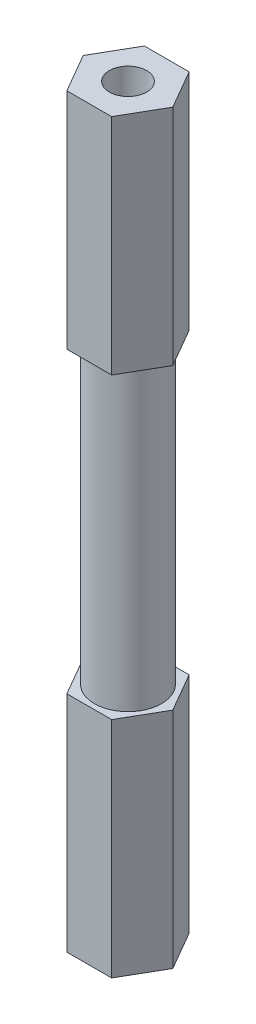
ISO-10303-21;
HEADER;
FILE_DESCRIPTION(('STEP AP214'),'2;1');
FILE_NAME('part.step','',(''),(''),'','','');
FILE_SCHEMA(('AUTOMOTIVE_DESIGN { 1 0 10303 214 1 1 1 1 }'));
ENDSEC;
DATA;
#1=APPLICATION_CONTEXT('core data for automotive mechanical design processes');
#2=APPLICATION_PROTOCOL_DEFINITION('international standard','automotive_design',2000,#1);
#3=PRODUCT_CONTEXT('',#1,'mechanical');
#4=PRODUCT('Part','Part','',(#3));
#5=PRODUCT_RELATED_PRODUCT_CATEGORY('part','',(#4));
#6=PRODUCT_DEFINITION_FORMATION('','',#4);
#7=PRODUCT_DEFINITION_CONTEXT('part definition',#1,'design');
#8=PRODUCT_DEFINITION('design','',#6,#7);
#9=PRODUCT_DEFINITION_SHAPE('','',#8);
#10=(LENGTH_UNIT() NAMED_UNIT(*) SI_UNIT(.MILLI.,.METRE.));
#11=(NAMED_UNIT(*) PLANE_ANGLE_UNIT() SI_UNIT($,.RADIAN.));
#12=(NAMED_UNIT(*) SI_UNIT($,.STERADIAN.) SOLID_ANGLE_UNIT());
#13=UNCERTAINTY_MEASURE_WITH_UNIT(LENGTH_MEASURE(1.E-05),#10,'distance_accuracy_value','');
#14=(GEOMETRIC_REPRESENTATION_CONTEXT(3) GLOBAL_UNCERTAINTY_ASSIGNED_CONTEXT((#13)) GLOBAL_UNIT_ASSIGNED_CONTEXT((#10,
#11,#12)) REPRESENTATION_CONTEXT('',''));
#15=CARTESIAN_POINT('',(0.,0.,0.));
#16=DIRECTION('',(0.,0.,1.));
#17=DIRECTION('',(1.,0.,0.));
#18=AXIS2_PLACEMENT_3D('',#15,#16,#17);
#19=CARTESIAN_POINT('',(0.,10.,0.));
#20=DIRECTION('',(0.,1.,0.));
#21=DIRECTION('',(0.,0.,1.));
#22=AXIS2_PLACEMENT_3D('',#19,#20,#21);
#23=PLANE('',#22);
#24=CARTESIAN_POINT('',(0.,10.,0.));
#25=DIRECTION('',(0.,1.,0.));
#26=DIRECTION('',(0.,0.,1.));
#27=AXIS2_PLACEMENT_3D('',#24,#25,#26);
#28=CIRCLE('',#27,1.24999999999999);
#29=CARTESIAN_POINT('',(0.,10.,1.24999999999999));
#30=VERTEX_POINT('',#29);
#31=EDGE_CURVE('E146',#30,#30,#28,.T.);
#32=ORIENTED_EDGE('',*,*,#31,.T.);
#33=EDGE_LOOP('',(#32));
#34=FACE_BOUND('',#33,.T.);
#35=ADVANCED_FACE('F18',(#34),#23,.T.);
#36=CARTESIAN_POINT('',(0.,-20.,0.));
#37=DIRECTION('',(0.,-1.,0.));
#38=DIRECTION('',(0.,0.,-1.));
#39=AXIS2_PLACEMENT_3D('',#36,#37,#38);
#40=PLANE('',#39);
#41=CARTESIAN_POINT('',(0.,-20.,0.));
#42=DIRECTION('',(0.,1.,0.));
#43=DIRECTION('',(0.,0.,1.));
#44=AXIS2_PLACEMENT_3D('',#41,#42,#43);
#45=CIRCLE('',#44,1.24999999999999);
#46=CARTESIAN_POINT('',(0.,-20.,1.24999999999999));
#47=VERTEX_POINT('',#46);
#48=EDGE_CURVE('E143',#47,#47,#45,.F.);
#49=ORIENTED_EDGE('',*,*,#48,.T.);
#50=EDGE_LOOP('',(#49));
#51=FACE_BOUND('',#50,.T.);
#52=ADVANCED_FACE('F239',(#51),#40,.T.);
#53=CARTESIAN_POINT('',(0.,20.,0.));
#54=DIRECTION('',(0.,1.,0.));
#55=DIRECTION('',(0.,0.,1.));
#56=AXIS2_PLACEMENT_3D('',#53,#54,#55);
#57=CYLINDRICAL_SURFACE('',#56,1.24999999999999);
#58=ORIENTED_EDGE('',*,*,#31,.F.);
#59=EDGE_LOOP('',(#58));
#60=FACE_BOUND('',#59,.T.);
#61=CARTESIAN_POINT('',(0.,20.,0.));
#62=DIRECTION('',(0.,1.,0.));
#63=DIRECTION('',(0.,0.,1.));
#64=AXIS2_PLACEMENT_3D('',#61,#62,#63);
#65=CIRCLE('',#64,1.24999999999999);
#66=CARTESIAN_POINT('',(0.,20.,1.24999999999999));
#67=VERTEX_POINT('',#66);
#68=EDGE_CURVE('E140',#67,#67,#65,.T.);
#69=ORIENTED_EDGE('',*,*,#68,.T.);
#70=EDGE_LOOP('',(#69));
#71=FACE_BOUND('',#70,.T.);
#72=ADVANCED_FACE('F236',(#60,#71),#57,.F.);
#73=CARTESIAN_POINT('',(0.,20.,0.));
#74=DIRECTION('',(0.,1.,0.));
#75=DIRECTION('',(0.,0.,1.));
#76=AXIS2_PLACEMENT_3D('',#73,#74,#75);
#77=CYLINDRICAL_SURFACE('',#76,1.24999999999999);
#78=CARTESIAN_POINT('',(0.,-30.,0.));
#79=DIRECTION('',(0.,1.,0.));
#80=DIRECTION('',(0.,0.,1.));
#81=AXIS2_PLACEMENT_3D('',#78,#79,#80);
#82=CIRCLE('',#81,1.24999999999999);
#83=CARTESIAN_POINT('',(0.,-30.,1.24999999999999));
#84=VERTEX_POINT('',#83);
#85=EDGE_CURVE('E117',#84,#84,#82,.T.);
#86=ORIENTED_EDGE('',*,*,#85,.F.);
#87=EDGE_LOOP('',(#86));
#88=FACE_BOUND('',#87,.T.);
#89=ORIENTED_EDGE('',*,*,#48,.F.);
#90=EDGE_LOOP('',(#89));
#91=FACE_BOUND('',#90,.T.);
#92=ADVANCED_FACE('F233',(#88,#91),#77,.F.);
#93=CARTESIAN_POINT('',(0.,20.,0.));
#94=DIRECTION('',(0.,-1.,0.));
#95=DIRECTION('',(0.,0.,-1.));
#96=AXIS2_PLACEMENT_3D('',#93,#94,#95);
#97=PLANE('',#96);
#98=DIRECTION('',(0.500000000050997,0.,0.866025403754996));
#99=VECTOR('',#98,1.);
#100=CARTESIAN_POINT('',(-3.,20.,0.));
#101=LINE('',#100,#99);
#102=CARTESIAN_POINT('',(-1.499999999898,20.,2.59807621106625));
#103=VERTEX_POINT('',#102);
#104=CARTESIAN_POINT('',(-2.99999999990438,20.,3.31240072663615E-11));
#105=VERTEX_POINT('',#104);
#106=EDGE_CURVE('E440',#103,#105,#101,.F.);
#107=ORIENTED_EDGE('',*,*,#106,.F.);
#108=DIRECTION('',(1.,0.,0.));
#109=VECTOR('',#108,1.);
#110=CARTESIAN_POINT('',(-1.5,20.,2.598076211));
#111=LINE('',#110,#109);
#112=CARTESIAN_POINT('',(1.49999999991076,20.,2.59807621108832));
#113=VERTEX_POINT('',#112);
#114=EDGE_CURVE('E113',#113,#103,#111,.F.);
#115=ORIENTED_EDGE('',*,*,#114,.F.);
#116=DIRECTION('',(0.500000000050997,0.,-0.866025403754996));
#117=VECTOR('',#116,1.);
#118=CARTESIAN_POINT('',(1.5,20.,2.598076211));
#119=LINE('',#118,#117);
#120=CARTESIAN_POINT('',(2.99999999990438,20.,-3.31331723412978E-11));
#121=VERTEX_POINT('',#120);
#122=EDGE_CURVE('E108',#121,#113,#119,.F.);
#123=ORIENTED_EDGE('',*,*,#122,.F.);
#124=DIRECTION('',(-0.500000000050997,0.,-0.866025403754996));
#125=VECTOR('',#124,1.);
#126=CARTESIAN_POINT('',(3.,20.,0.));
#127=LINE('',#126,#125);
#128=CARTESIAN_POINT('',(1.49999999993323,20.,-2.59807621100522));
#129=VERTEX_POINT('',#128);
#130=EDGE_CURVE('E105',#129,#121,#127,.F.);
#131=ORIENTED_EDGE('',*,*,#130,.F.);
#132=DIRECTION('',(-1.,0.,0.));
#133=VECTOR('',#132,1.);
#134=CARTESIAN_POINT('',(1.5,20.,-2.598076211));
#135=LINE('',#134,#133);
#136=CARTESIAN_POINT('',(-1.49999999986614,20.,-2.59807621105519));
#137=VERTEX_POINT('',#136);
#138=EDGE_CURVE('E131',#137,#129,#135,.F.);
#139=ORIENTED_EDGE('',*,*,#138,.F.);
#140=DIRECTION('',(-0.500000000050997,0.,0.866025403754996));
#141=VECTOR('',#140,1.);
#142=CARTESIAN_POINT('',(-1.5,20.,-2.598076211));
#143=LINE('',#142,#141);
#144=EDGE_CURVE('E446',#105,#137,#143,.F.);
#145=ORIENTED_EDGE('',*,*,#144,.F.);
#146=EDGE_LOOP('',(#107,#115,#123,#131,#139,#145));
#147=FACE_BOUND('',#146,.T.);
#148=ORIENTED_EDGE('',*,*,#68,.F.);
#149=EDGE_LOOP('',(#148));
#150=FACE_BOUND('',#149,.T.);
#151=ADVANCED_FACE('F110',(#147,#150),#97,.F.);
#152=CARTESIAN_POINT('',(0.,-30.,0.));
#153=DIRECTION('',(0.,-1.,0.));
#154=DIRECTION('',(0.,0.,-1.));
#155=AXIS2_PLACEMENT_3D('',#152,#153,#154);
#156=PLANE('',#155);
#157=ORIENTED_EDGE('',*,*,#85,.T.);
#158=EDGE_LOOP('',(#157));
#159=FACE_BOUND('',#158,.T.);
#160=DIRECTION('',(-1.,0.,0.));
#161=VECTOR('',#160,1.);
#162=CARTESIAN_POINT('',(1.5,-30.,-2.598076211));
#163=LINE('',#162,#161);
#164=CARTESIAN_POINT('',(1.50000000008808,-30.,-2.59807621101365));
#165=VERTEX_POINT('',#164);
#166=CARTESIAN_POINT('',(-1.49999999990438,-30.,-2.5980762110552));
#167=VERTEX_POINT('',#166);
#168=EDGE_CURVE('E407',#165,#167,#163,.T.);
#169=ORIENTED_EDGE('',*,*,#168,.F.);
#170=DIRECTION('',(-0.500000000050997,0.,-0.866025403754996));
#171=VECTOR('',#170,1.);
#172=CARTESIAN_POINT('',(3.,-30.,0.));
#173=LINE('',#172,#171);
#174=CARTESIAN_POINT('',(3.,-30.,0.));
#175=VERTEX_POINT('',#174);
#176=EDGE_CURVE('E410',#175,#165,#173,.T.);
#177=ORIENTED_EDGE('',*,*,#176,.F.);
#178=DIRECTION('',(0.500000000050997,0.,-0.866025403754996));
#179=VECTOR('',#178,1.);
#180=CARTESIAN_POINT('',(1.5,-30.,2.598076211));
#181=LINE('',#180,#179);
#182=CARTESIAN_POINT('',(1.4999999999745,-30.,2.59807621104416));
#183=VERTEX_POINT('',#182);
#184=EDGE_CURVE('E428',#183,#175,#181,.T.);
#185=ORIENTED_EDGE('',*,*,#184,.F.);
#186=DIRECTION('',(1.,0.,0.));
#187=VECTOR('',#186,1.);
#188=CARTESIAN_POINT('',(-1.5,-30.,2.598076211));
#189=LINE('',#188,#187);
#190=CARTESIAN_POINT('',(-1.49999999996494,-30.,2.59807621101656));
#191=VERTEX_POINT('',#190);
#192=EDGE_CURVE('E479',#191,#183,#189,.T.);
#193=ORIENTED_EDGE('',*,*,#192,.F.);
#194=DIRECTION('',(0.500000000050997,0.,0.866025403754996));
#195=VECTOR('',#194,1.);
#196=CARTESIAN_POINT('',(-3.,-30.,0.));
#197=LINE('',#196,#195);
#198=CARTESIAN_POINT('',(-2.99999999997131,-30.,-4.96840027134389E-11));
#199=VERTEX_POINT('',#198);
#200=EDGE_CURVE('E466',#199,#191,#197,.T.);
#201=ORIENTED_EDGE('',*,*,#200,.F.);
#202=DIRECTION('',(-0.500000000050997,0.,0.866025403754996));
#203=VECTOR('',#202,1.);
#204=CARTESIAN_POINT('',(-1.5,-30.,-2.598076211));
#205=LINE('',#204,#203);
#206=EDGE_CURVE('E413',#167,#199,#205,.T.);
#207=ORIENTED_EDGE('',*,*,#206,.F.);
#208=EDGE_LOOP('',(#169,#177,#185,#193,#201,#207));
#209=FACE_BOUND('',#208,.T.);
#210=ADVANCED_FACE('F227',(#159,#209),#156,.T.);
#211=CARTESIAN_POINT('',(1.5,10.110836135,2.598076211));
#212=DIRECTION('',(0.866025403754996,0.,0.500000000050997));
#213=DIRECTION('',(0.500000000050997,0.,-0.866025403754996));
#214=AXIS2_PLACEMENT_3D('',#211,#212,#213);
#215=PLANE('',#214);
#216=DIRECTION('',(0.,1.,0.));
#217=VECTOR('',#216,1.);
#218=CARTESIAN_POINT('',(2.9999999999235,10.110836135,-1.32509278878395E-10));
#219=LINE('',#218,#217);
#220=CARTESIAN_POINT('',(2.99999999998087,5.,-3.31270995793024E-11));
#221=VERTEX_POINT('',#220);
#222=EDGE_CURVE('E116',#121,#221,#219,.F.);
#223=ORIENTED_EDGE('',*,*,#222,.F.);
#224=ORIENTED_EDGE('',*,*,#122,.T.);
#225=DIRECTION('',(0.,1.,0.));
#226=VECTOR('',#225,1.);
#227=CARTESIAN_POINT('',(1.49999999994901,10.110836135,2.598076211));
#228=LINE('',#227,#226);
#229=CARTESIAN_POINT('',(1.49999999993626,5.,2.59807621108832));
#230=VERTEX_POINT('',#229);
#231=EDGE_CURVE('E435',#230,#113,#228,.T.);
#232=ORIENTED_EDGE('',*,*,#231,.F.);
#233=DIRECTION('',(0.500000000050997,0.,-0.866025403754996));
#234=VECTOR('',#233,1.);
#235=CARTESIAN_POINT('',(1.49999999994901,5.00000000000001,2.59807621108832));
#236=LINE('',#235,#234);
#237=EDGE_CURVE('E122',#230,#221,#236,.T.);
#238=ORIENTED_EDGE('',*,*,#237,.T.);
#239=EDGE_LOOP('',(#223,#224,#232,#238));
#240=FACE_BOUND('',#239,.T.);
#241=ADVANCED_FACE('F120',(#240),#215,.T.);
#242=CARTESIAN_POINT('',(3.,10.110836135,0.));
#243=DIRECTION('',(0.866025403754996,0.,-0.500000000050997));
#244=DIRECTION('',(-0.500000000050997,0.,-0.866025403754996));
#245=AXIS2_PLACEMENT_3D('',#242,#243,#244);
#246=PLANE('',#245);
#247=DIRECTION('',(0.,1.,0.));
#248=VECTOR('',#247,1.);
#249=CARTESIAN_POINT('',(1.49999999984699,10.110836135,-2.598076211));
#250=LINE('',#249,#248);
#251=CARTESIAN_POINT('',(1.49999999999095,5.,-2.59807621098314));
#252=VERTEX_POINT('',#251);
#253=EDGE_CURVE('E128',#129,#252,#250,.F.);
#254=ORIENTED_EDGE('',*,*,#253,.F.);
#255=ORIENTED_EDGE('',*,*,#130,.T.);
#256=ORIENTED_EDGE('',*,*,#222,.T.);
#257=DIRECTION('',(-0.500000000031531,0.,-0.866025403766235));
#258=VECTOR('',#257,1.);
#259=CARTESIAN_POINT('',(3.,5.00000000000001,0.));
#260=LINE('',#259,#258);
#261=EDGE_CURVE('E465',#221,#252,#260,.T.);
#262=ORIENTED_EDGE('',*,*,#261,.T.);
#263=EDGE_LOOP('',(#254,#255,#256,#262));
#264=FACE_BOUND('',#263,.T.);
#265=ADVANCED_FACE('F126',(#264),#246,.T.);
#266=CARTESIAN_POINT('',(1.5,10.110836135,-2.598076211));
#267=DIRECTION('',(0.,0.,-1.));
#268=DIRECTION('',(-1.,0.,0.));
#269=AXIS2_PLACEMENT_3D('',#266,#267,#268);
#270=PLANE('',#269);
#271=DIRECTION('',(0.,1.,0.));
#272=VECTOR('',#271,1.);
#273=CARTESIAN_POINT('',(-1.49999999992352,10.110836135,-2.59807621113247));
#274=LINE('',#273,#272);
#275=CARTESIAN_POINT('',(-1.49999999987889,5.,-2.59807621103312));
#276=VERTEX_POINT('',#275);
#277=EDGE_CURVE('E449',#137,#276,#274,.F.);
#278=ORIENTED_EDGE('',*,*,#277,.F.);
#279=ORIENTED_EDGE('',*,*,#138,.T.);
#280=ORIENTED_EDGE('',*,*,#253,.T.);
#281=DIRECTION('',(1.,0.,0.));
#282=VECTOR('',#281,1.);
#283=CARTESIAN_POINT('',(0.,5.00000000000001,-2.598076211));
#284=LINE('',#283,#282);
#285=EDGE_CURVE('E468',#252,#276,#284,.F.);
#286=ORIENTED_EDGE('',*,*,#285,.T.);
#287=EDGE_LOOP('',(#278,#279,#280,#286));
#288=FACE_BOUND('',#287,.T.);
#289=ADVANCED_FACE('F218',(#288),#270,.T.);
#290=CARTESIAN_POINT('',(-1.5,10.110836135,-2.598076211));
#291=DIRECTION('',(-0.866025403754996,0.,-0.500000000050997));
#292=DIRECTION('',(-0.500000000050997,0.,0.866025403754996));
#293=AXIS2_PLACEMENT_3D('',#290,#291,#292);
#294=PLANE('',#293);
#295=DIRECTION('',(0.,1.,0.));
#296=VECTOR('',#295,1.);
#297=CARTESIAN_POINT('',(-2.9999999999235,10.110836135,1.32493551553057E-10));
#298=LINE('',#297,#296);
#299=CARTESIAN_POINT('',(-2.99999999998088,5.,3.31235123558634E-11));
#300=VERTEX_POINT('',#299);
#301=EDGE_CURVE('E443',#105,#300,#298,.F.);
#302=ORIENTED_EDGE('',*,*,#301,.F.);
#303=ORIENTED_EDGE('',*,*,#144,.T.);
#304=ORIENTED_EDGE('',*,*,#277,.T.);
#305=DIRECTION('',(-0.500000000076495,0.,0.866025403740274));
#306=VECTOR('',#305,1.);
#307=CARTESIAN_POINT('',(-1.49999999984701,5.00000000000001,-2.59807621108833));
#308=LINE('',#307,#306);
#309=EDGE_CURVE('E456',#276,#300,#308,.T.);
#310=ORIENTED_EDGE('',*,*,#309,.T.);
#311=EDGE_LOOP('',(#302,#303,#304,#310));
#312=FACE_BOUND('',#311,.T.);
#313=ADVANCED_FACE('F214',(#312),#294,.T.);
#314=CARTESIAN_POINT('',(-3.,10.110836135,0.));
#315=DIRECTION('',(-0.866025403754996,0.,0.500000000050997));
#316=DIRECTION('',(0.500000000050997,0.,0.866025403754996));
#317=AXIS2_PLACEMENT_3D('',#314,#315,#316);
#318=PLANE('',#317);
#319=DIRECTION('',(0.,1.,0.));
#320=VECTOR('',#319,1.);
#321=CARTESIAN_POINT('',(-1.499999999847,10.110836135,2.598076211));
#322=LINE('',#321,#320);
#323=CARTESIAN_POINT('',(-1.4999999999235,5.,2.59807621106625));
#324=VERTEX_POINT('',#323);
#325=EDGE_CURVE('E437',#103,#324,#322,.F.);
#326=ORIENTED_EDGE('',*,*,#325,.F.);
#327=ORIENTED_EDGE('',*,*,#106,.T.);
#328=ORIENTED_EDGE('',*,*,#301,.T.);
#329=DIRECTION('',(0.500000000050997,0.,0.866025403754996));
#330=VECTOR('',#329,1.);
#331=CARTESIAN_POINT('',(-3.,5.00000000000001,0.));
#332=LINE('',#331,#330);
#333=EDGE_CURVE('E458',#300,#324,#332,.T.);
#334=ORIENTED_EDGE('',*,*,#333,.T.);
#335=EDGE_LOOP('',(#326,#327,#328,#334));
#336=FACE_BOUND('',#335,.T.);
#337=ADVANCED_FACE('F210',(#336),#318,.T.);
#338=CARTESIAN_POINT('',(-1.5,10.110836135,2.598076211));
#339=DIRECTION('',(0.,0.,1.));
#340=DIRECTION('',(1.,0.,0.));
#341=AXIS2_PLACEMENT_3D('',#338,#339,#340);
#342=PLANE('',#341);
#343=ORIENTED_EDGE('',*,*,#231,.T.);
#344=ORIENTED_EDGE('',*,*,#114,.T.);
#345=ORIENTED_EDGE('',*,*,#325,.T.);
#346=DIRECTION('',(1.,0.,0.));
#347=VECTOR('',#346,1.);
#348=CARTESIAN_POINT('',(0.,5.00000000000001,2.59807621108833));
#349=LINE('',#348,#347);
#350=EDGE_CURVE('E461',#324,#230,#349,.T.);
#351=ORIENTED_EDGE('',*,*,#350,.T.);
#352=EDGE_LOOP('',(#343,#344,#345,#351));
#353=FACE_BOUND('',#352,.T.);
#354=ADVANCED_FACE('F206',(#353),#342,.T.);
#355=CARTESIAN_POINT('',(-1.5,10.110836135,-2.598076211));
#356=DIRECTION('',(-0.866025403754996,0.,-0.500000000050997));
#357=DIRECTION('',(-0.500000000050997,0.,0.866025403754996));
#358=AXIS2_PLACEMENT_3D('',#355,#356,#357);
#359=PLANE('',#358);
#360=DIRECTION('',(0.,1.,0.));
#361=VECTOR('',#360,1.);
#362=CARTESIAN_POINT('',(-1.49999999984701,10.110836135,-2.598076211));
#363=LINE('',#362,#361);
#364=CARTESIAN_POINT('',(-1.49999999990439,-15.,-2.59807621103312));
#365=VERTEX_POINT('',#364);
#366=EDGE_CURVE('E417',#167,#365,#363,.T.);
#367=ORIENTED_EDGE('',*,*,#366,.F.);
#368=ORIENTED_EDGE('',*,*,#206,.T.);
#369=DIRECTION('',(0.,1.,0.));
#370=VECTOR('',#369,1.);
#371=CARTESIAN_POINT('',(-3.,10.110836135,0.));
#372=LINE('',#371,#370);
#373=CARTESIAN_POINT('',(-2.99999999998088,-15.,-3.31222061998063E-11));
#374=VERTEX_POINT('',#373);
#375=EDGE_CURVE('E471',#374,#199,#372,.F.);
#376=ORIENTED_EDGE('',*,*,#375,.F.);
#377=DIRECTION('',(0.500000000089237,0.,-0.866025403732918));
#378=VECTOR('',#377,1.);
#379=CARTESIAN_POINT('',(-3.,-15.,0.));
#380=LINE('',#379,#378);
#381=EDGE_CURVE('E462',#374,#365,#380,.T.);
#382=ORIENTED_EDGE('',*,*,#381,.T.);
#383=EDGE_LOOP('',(#367,#368,#376,#382));
#384=FACE_BOUND('',#383,.T.);
#385=ADVANCED_FACE('F202',(#384),#359,.T.);
#386=CARTESIAN_POINT('',(1.5,10.110836135,-2.598076211));
#387=DIRECTION('',(0.,0.,-1.));
#388=DIRECTION('',(-1.,0.,0.));
#389=AXIS2_PLACEMENT_3D('',#386,#387,#388);
#390=PLANE('',#389);
#391=DIRECTION('',(0.,1.,0.));
#392=VECTOR('',#391,1.);
#393=CARTESIAN_POINT('',(1.50000000001947,10.110836135,-2.59807621096628));
#394=LINE('',#393,#392);
#395=CARTESIAN_POINT('',(1.50000000013236,-15.,-2.59807621099157));
#396=VERTEX_POINT('',#395);
#397=EDGE_CURVE('E416',#165,#396,#394,.T.);
#398=ORIENTED_EDGE('',*,*,#397,.F.);
#399=ORIENTED_EDGE('',*,*,#168,.T.);
#400=ORIENTED_EDGE('',*,*,#366,.T.);
#401=DIRECTION('',(1.,0.,0.));
#402=VECTOR('',#401,1.);
#403=CARTESIAN_POINT('',(0.,-15.,-2.598076211));
#404=LINE('',#403,#402);
#405=EDGE_CURVE('E421',#365,#396,#404,.T.);
#406=ORIENTED_EDGE('',*,*,#405,.T.);
#407=EDGE_LOOP('',(#398,#399,#400,#406));
#408=FACE_BOUND('',#407,.T.);
#409=ADVANCED_FACE('F198',(#408),#390,.T.);
#410=CARTESIAN_POINT('',(3.,10.110836135,0.));
#411=DIRECTION('',(0.866025403754996,0.,-0.500000000050997));
#412=DIRECTION('',(-0.500000000050997,0.,-0.866025403754996));
#413=AXIS2_PLACEMENT_3D('',#410,#411,#412);
#414=PLANE('',#413);
#415=DIRECTION('',(0.,1.,0.));
#416=VECTOR('',#415,1.);
#417=CARTESIAN_POINT('',(3.,10.110836135,0.));
#418=LINE('',#417,#416);
#419=CARTESIAN_POINT('',(3.,-15.,0.));
#420=VERTEX_POINT('',#419);
#421=EDGE_CURVE('E425',#175,#420,#418,.T.);
#422=ORIENTED_EDGE('',*,*,#421,.F.);
#423=ORIENTED_EDGE('',*,*,#176,.T.);
#424=ORIENTED_EDGE('',*,*,#397,.T.);
#425=DIRECTION('',(0.5,0.,0.866025403784439));
#426=VECTOR('',#425,1.);
#427=CARTESIAN_POINT('',(1.50000000015299,-15.,-2.59807621108833));
#428=LINE('',#427,#426);
#429=EDGE_CURVE('E489',#396,#420,#428,.T.);
#430=ORIENTED_EDGE('',*,*,#429,.T.);
#431=EDGE_LOOP('',(#422,#423,#424,#430));
#432=FACE_BOUND('',#431,.T.);
#433=ADVANCED_FACE('F194',(#432),#414,.T.);
#434=CARTESIAN_POINT('',(1.5,10.110836135,2.598076211));
#435=DIRECTION('',(0.866025403754996,0.,0.500000000050997));
#436=DIRECTION('',(0.500000000050997,0.,-0.866025403754996));
#437=AXIS2_PLACEMENT_3D('',#434,#435,#436);
#438=PLANE('',#437);
#439=DIRECTION('',(0.,1.,0.));
#440=VECTOR('',#439,1.);
#441=CARTESIAN_POINT('',(1.5,10.110836135,2.598076211));
#442=LINE('',#441,#440);
#443=CARTESIAN_POINT('',(1.49999999996176,-15.,2.59807621106624));
#444=VERTEX_POINT('',#443);
#445=EDGE_CURVE('E482',#183,#444,#442,.T.);
#446=ORIENTED_EDGE('',*,*,#445,.F.);
#447=ORIENTED_EDGE('',*,*,#184,.T.);
#448=ORIENTED_EDGE('',*,*,#421,.T.);
#449=DIRECTION('',(-0.500000000050997,0.,0.866025403754996));
#450=VECTOR('',#449,1.);
#451=CARTESIAN_POINT('',(3.,-15.,0.));
#452=LINE('',#451,#450);
#453=EDGE_CURVE('E491',#420,#444,#452,.T.);
#454=ORIENTED_EDGE('',*,*,#453,.T.);
#455=EDGE_LOOP('',(#446,#447,#448,#454));
#456=FACE_BOUND('',#455,.T.);
#457=ADVANCED_FACE('F191',(#456),#438,.T.);
#458=CARTESIAN_POINT('',(-1.5,10.110836135,2.598076211));
#459=DIRECTION('',(0.,0.,1.));
#460=DIRECTION('',(1.,0.,0.));
#461=AXIS2_PLACEMENT_3D('',#458,#459,#460);
#462=PLANE('',#461);
#463=DIRECTION('',(0.,1.,0.));
#464=VECTOR('',#463,1.);
#465=CARTESIAN_POINT('',(-1.49999999996175,10.110836135,2.59807621106625));
#466=LINE('',#465,#464);
#467=CARTESIAN_POINT('',(-1.49999999995219,-15.,2.59807621103864));
#468=VERTEX_POINT('',#467);
#469=EDGE_CURVE('E477',#191,#468,#466,.T.);
#470=ORIENTED_EDGE('',*,*,#469,.F.);
#471=ORIENTED_EDGE('',*,*,#192,.T.);
#472=ORIENTED_EDGE('',*,*,#445,.T.);
#473=DIRECTION('',(1.,0.,0.));
#474=VECTOR('',#473,1.);
#475=CARTESIAN_POINT('',(0.,-15.,2.59807621108832));
#476=LINE('',#475,#474);
#477=EDGE_CURVE('E36',#444,#468,#476,.F.);
#478=ORIENTED_EDGE('',*,*,#477,.T.);
#479=EDGE_LOOP('',(#470,#471,#472,#478));
#480=FACE_BOUND('',#479,.T.);
#481=ADVANCED_FACE('F187',(#480),#462,.T.);
#482=CARTESIAN_POINT('',(-3.,10.110836135,0.));
#483=DIRECTION('',(-0.866025403754996,0.,0.500000000050997));
#484=DIRECTION('',(0.500000000050997,0.,0.866025403754996));
#485=AXIS2_PLACEMENT_3D('',#482,#483,#484);
#486=PLANE('',#485);
#487=ORIENTED_EDGE('',*,*,#375,.T.);
#488=ORIENTED_EDGE('',*,*,#200,.T.);
#489=ORIENTED_EDGE('',*,*,#469,.T.);
#490=DIRECTION('',(-0.500000000050997,0.,-0.866025403754996));
#491=VECTOR('',#490,1.);
#492=CARTESIAN_POINT('',(-1.499999999949,-15.,2.59807621108833));
#493=LINE('',#492,#491);
#494=EDGE_CURVE('E137',#468,#374,#493,.T.);
#495=ORIENTED_EDGE('',*,*,#494,.T.);
#496=EDGE_LOOP('',(#487,#488,#489,#495));
#497=FACE_BOUND('',#496,.T.);
#498=ADVANCED_FACE('F183',(#497),#486,.T.);
#499=CARTESIAN_POINT('',(0.,5.00000000000001,0.));
#500=DIRECTION('',(0.,1.,0.));
#501=DIRECTION('',(0.,0.,1.));
#502=AXIS2_PLACEMENT_3D('',#499,#500,#501);
#503=PLANE('',#502);
#504=ORIENTED_EDGE('',*,*,#333,.F.);
#505=ORIENTED_EDGE('',*,*,#309,.F.);
#506=ORIENTED_EDGE('',*,*,#285,.F.);
#507=ORIENTED_EDGE('',*,*,#261,.F.);
#508=ORIENTED_EDGE('',*,*,#237,.F.);
#509=ORIENTED_EDGE('',*,*,#350,.F.);
#510=EDGE_LOOP('',(#504,#505,#506,#507,#508,#509));
#511=FACE_BOUND('',#510,.T.);
#512=CARTESIAN_POINT('',(0.,5.00000000000001,0.));
#513=DIRECTION('',(0.,-1.,0.));
#514=DIRECTION('',(0.,0.,-1.));
#515=AXIS2_PLACEMENT_3D('',#512,#513,#514);
#516=CIRCLE('',#515,2.25);
#517=CARTESIAN_POINT('',(0.,5.00000000000001,-2.25));
#518=VERTEX_POINT('',#517);
#519=EDGE_CURVE('E27',#518,#518,#516,.T.);
#520=ORIENTED_EDGE('',*,*,#519,.F.);
#521=EDGE_LOOP('',(#520));
#522=FACE_BOUND('',#521,.T.);
#523=ADVANCED_FACE('F179',(#511,#522),#503,.F.);
#524=CARTESIAN_POINT('',(0.,-15.,0.));
#525=DIRECTION('',(0.,-1.,0.));
#526=DIRECTION('',(0.,0.,-1.));
#527=AXIS2_PLACEMENT_3D('',#524,#525,#526);
#528=PLANE('',#527);
#529=ORIENTED_EDGE('',*,*,#477,.F.);
#530=ORIENTED_EDGE('',*,*,#453,.F.);
#531=ORIENTED_EDGE('',*,*,#429,.F.);
#532=ORIENTED_EDGE('',*,*,#405,.F.);
#533=ORIENTED_EDGE('',*,*,#381,.F.);
#534=ORIENTED_EDGE('',*,*,#494,.F.);
#535=EDGE_LOOP('',(#529,#530,#531,#532,#533,#534));
#536=FACE_BOUND('',#535,.T.);
#537=CARTESIAN_POINT('',(0.,-15.,0.));
#538=DIRECTION('',(0.,-1.,0.));
#539=DIRECTION('',(0.,0.,-1.));
#540=AXIS2_PLACEMENT_3D('',#537,#538,#539);
#541=CIRCLE('',#540,2.25);
#542=CARTESIAN_POINT('',(0.,-15.,-2.25));
#543=VERTEX_POINT('',#542);
#544=EDGE_CURVE('E11',#543,#543,#541,.F.);
#545=ORIENTED_EDGE('',*,*,#544,.F.);
#546=EDGE_LOOP('',(#545));
#547=FACE_BOUND('',#546,.T.);
#548=ADVANCED_FACE('F175',(#536,#547),#528,.F.);
#549=CARTESIAN_POINT('',(0.,10.,0.));
#550=DIRECTION('',(0.,-1.,0.));
#551=DIRECTION('',(0.,0.,-1.));
#552=AXIS2_PLACEMENT_3D('',#549,#550,#551);
#553=CYLINDRICAL_SURFACE('',#552,2.25);
#554=ORIENTED_EDGE('',*,*,#544,.T.);
#555=EDGE_LOOP('',(#554));
#556=FACE_BOUND('',#555,.T.);
#557=ORIENTED_EDGE('',*,*,#519,.T.);
#558=EDGE_LOOP('',(#557));
#559=FACE_BOUND('',#558,.T.);
#560=ADVANCED_FACE('F172',(#556,#559),#553,.T.);
#561=CLOSED_SHELL('',(#35,#52,#72,#92,#151,#210,#241,#265,#289,#313,#337,#354,#385,#409,#433,
#457,#481,#498,#523,#548,#560));
#562=CARTESIAN_POINT('',(0.,5.00000000000001,0.));
#563=DIRECTION('',(0.,1.,0.));
#564=DIRECTION('',(0.,0.,1.));
#565=AXIS2_PLACEMENT_3D('',#562,#563,#564);
#566=PLANE('',#565);
#567=CARTESIAN_POINT('',(0.,5.,0.));
#568=DIRECTION('',(0.,1.,0.));
#569=DIRECTION('',(0.,0.,1.));
#570=AXIS2_PLACEMENT_3D('',#567,#568,#569);
#571=CIRCLE('',#570,1.24999999999999);
#572=CARTESIAN_POINT('',(0.,5.,1.24999999999999));
#573=VERTEX_POINT('',#572);
#574=EDGE_CURVE('E21',#573,#573,#571,.F.);
#575=ORIENTED_EDGE('',*,*,#574,.T.);
#576=EDGE_LOOP('',(#575));
#577=FACE_BOUND('',#576,.T.);
#578=ADVANCED_FACE('F155',(#577),#566,.F.);
#579=CARTESIAN_POINT('',(0.,20.,0.));
#580=DIRECTION('',(0.,1.,0.));
#581=DIRECTION('',(0.,0.,1.));
#582=AXIS2_PLACEMENT_3D('',#579,#580,#581);
#583=CYLINDRICAL_SURFACE('',#582,1.24999999999999);
#584=ORIENTED_EDGE('',*,*,#574,.F.);
#585=EDGE_LOOP('',(#584));
#586=FACE_BOUND('',#585,.T.);
#587=CARTESIAN_POINT('',(0.,-15.,0.));
#588=DIRECTION('',(0.,1.,0.));
#589=DIRECTION('',(0.,0.,1.));
#590=AXIS2_PLACEMENT_3D('',#587,#588,#589);
#591=CIRCLE('',#590,1.24999999999999);
#592=CARTESIAN_POINT('',(0.,-15.,1.24999999999999));
#593=VERTEX_POINT('',#592);
#594=EDGE_CURVE('E148',#593,#593,#591,.F.);
#595=ORIENTED_EDGE('',*,*,#594,.T.);
#596=EDGE_LOOP('',(#595));
#597=FACE_BOUND('',#596,.T.);
#598=ADVANCED_FACE('F157',(#586,#597),#583,.F.);
#599=CARTESIAN_POINT('',(0.,-15.,0.));
#600=DIRECTION('',(0.,-1.,0.));
#601=DIRECTION('',(0.,0.,-1.));
#602=AXIS2_PLACEMENT_3D('',#599,#600,#601);
#603=PLANE('',#602);
#604=ORIENTED_EDGE('',*,*,#594,.F.);
#605=EDGE_LOOP('',(#604));
#606=FACE_BOUND('',#605,.T.);
#607=ADVANCED_FACE('F159',(#606),#603,.F.);
#608=CLOSED_SHELL('',(#578,#598,#607));
#609=ORIENTED_CLOSED_SHELL('',*,#608,.T.);
#610=BREP_WITH_VOIDS('B1',#561,(#609));
#611=ADVANCED_BREP_SHAPE_REPRESENTATION('',(#18,#610),#14);
#612=SHAPE_DEFINITION_REPRESENTATION(#9,#611);
ENDSEC;
END-ISO-10303-21;
